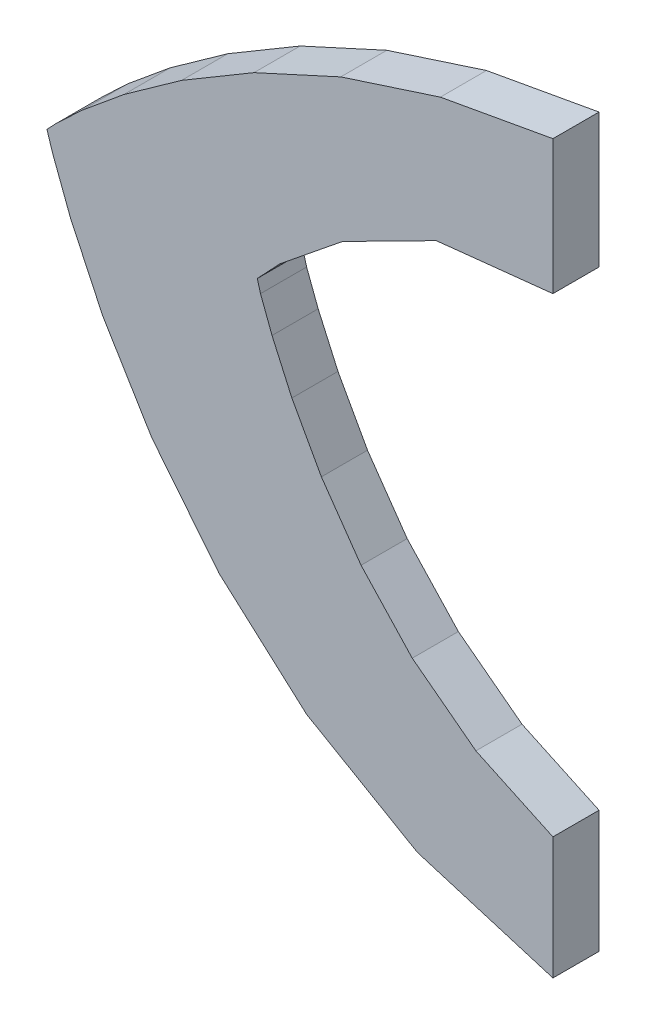
ISO-10303-21;
HEADER;
FILE_DESCRIPTION(('STEP AP214'),'2;1');
FILE_NAME('part.step','',(''),(''),'','','');
FILE_SCHEMA(('AUTOMOTIVE_DESIGN { 1 0 10303 214 1 1 1 1 }'));
ENDSEC;
DATA;
#1=APPLICATION_CONTEXT('core data for automotive mechanical design processes');
#2=APPLICATION_PROTOCOL_DEFINITION('international standard','automotive_design',2000,#1);
#3=PRODUCT_CONTEXT('',#1,'mechanical');
#4=PRODUCT('Part','Part','',(#3));
#5=PRODUCT_RELATED_PRODUCT_CATEGORY('part','',(#4));
#6=PRODUCT_DEFINITION_FORMATION('','',#4);
#7=PRODUCT_DEFINITION_CONTEXT('part definition',#1,'design');
#8=PRODUCT_DEFINITION('design','',#6,#7);
#9=PRODUCT_DEFINITION_SHAPE('','',#8);
#10=(LENGTH_UNIT() NAMED_UNIT(*) SI_UNIT(.MILLI.,.METRE.));
#11=(NAMED_UNIT(*) PLANE_ANGLE_UNIT() SI_UNIT($,.RADIAN.));
#12=(NAMED_UNIT(*) SI_UNIT($,.STERADIAN.) SOLID_ANGLE_UNIT());
#13=UNCERTAINTY_MEASURE_WITH_UNIT(LENGTH_MEASURE(1.E-05),#10,'distance_accuracy_value','');
#14=(GEOMETRIC_REPRESENTATION_CONTEXT(3) GLOBAL_UNCERTAINTY_ASSIGNED_CONTEXT((#13)) GLOBAL_UNIT_ASSIGNED_CONTEXT((#10,
#11,#12)) REPRESENTATION_CONTEXT('',''));
#15=CARTESIAN_POINT('',(0.,0.,0.));
#16=DIRECTION('',(0.,0.,1.));
#17=DIRECTION('',(1.,0.,0.));
#18=AXIS2_PLACEMENT_3D('',#15,#16,#17);
#19=CARTESIAN_POINT('',(0.,0.,0.1));
#20=DIRECTION('',(0.,0.,1.));
#21=DIRECTION('',(1.,0.,0.));
#22=AXIS2_PLACEMENT_3D('',#19,#20,#21);
#23=PLANE('',#22);
#24=DIRECTION('',(0.994353672393509,0.106116795077601,0.));
#25=VECTOR('',#24,1.);
#26=CARTESIAN_POINT('',(-1.526,1.481,0.1));
#27=LINE('',#26,#25);
#28=CARTESIAN_POINT('',(-1.273,1.508,0.1));
#29=VERTEX_POINT('',#28);
#30=CARTESIAN_POINT('',(-1.526,1.481,0.1));
#31=VERTEX_POINT('',#30);
#32=EDGE_CURVE('E226',#29,#31,#27,.F.);
#33=ORIENTED_EDGE('',*,*,#32,.F.);
#34=DIRECTION('',(0.,1.,0.));
#35=VECTOR('',#34,1.);
#36=CARTESIAN_POINT('',(-1.273,1.508,0.1));
#37=LINE('',#36,#35);
#38=CARTESIAN_POINT('',(-1.273,1.799,0.1));
#39=VERTEX_POINT('',#38);
#40=EDGE_CURVE('E20',#39,#29,#37,.F.);
#41=ORIENTED_EDGE('',*,*,#40,.F.);
#42=DIRECTION('',(-0.984127017445098,-0.177465527736,0.));
#43=VECTOR('',#42,1.);
#44=CARTESIAN_POINT('',(-1.273,1.799,0.1));
#45=LINE('',#44,#43);
#46=CARTESIAN_POINT('',(-1.517,1.755,0.1));
#47=VERTEX_POINT('',#46);
#48=EDGE_CURVE('E215',#47,#39,#45,.F.);
#49=ORIENTED_EDGE('',*,*,#48,.F.);
#50=DIRECTION('',(-0.951292655223298,-0.308289286414899,0.));
#51=VECTOR('',#50,1.);
#52=CARTESIAN_POINT('',(-1.517,1.755,0.1));
#53=LINE('',#52,#51);
#54=CARTESIAN_POINT('',(-1.733,1.685,0.1));
#55=VERTEX_POINT('',#54);
#56=EDGE_CURVE('E210',#55,#47,#53,.F.);
#57=ORIENTED_EDGE('',*,*,#56,.F.);
#58=DIRECTION('',(-0.909369932081494,-0.415988373186197,0.));
#59=VECTOR('',#58,1.);
#60=CARTESIAN_POINT('',(-1.733,1.685,0.1));
#61=LINE('',#60,#59);
#62=CARTESIAN_POINT('',(-1.921,1.599,0.1));
#63=VERTEX_POINT('',#62);
#64=EDGE_CURVE('E237',#63,#55,#61,.F.);
#65=ORIENTED_EDGE('',*,*,#64,.F.);
#66=DIRECTION('',(-0.860380537872695,-0.509652165746297,0.));
#67=VECTOR('',#66,1.);
#68=CARTESIAN_POINT('',(-1.921,1.599,0.1));
#69=LINE('',#68,#67);
#70=CARTESIAN_POINT('',(-2.078,1.506,0.1));
#71=VERTEX_POINT('',#70);
#72=EDGE_CURVE('E241',#71,#63,#69,.F.);
#73=ORIENTED_EDGE('',*,*,#72,.F.);
#74=DIRECTION('',(-0.814613200089862,-0.580004598463973,0.));
#75=VECTOR('',#74,1.);
#76=CARTESIAN_POINT('',(-2.078,1.506,0.1));
#77=LINE('',#76,#75);
#78=CARTESIAN_POINT('',(-2.203,1.417,0.1));
#79=VERTEX_POINT('',#78);
#80=EDGE_CURVE('E245',#79,#71,#77,.F.);
#81=ORIENTED_EDGE('',*,*,#80,.F.);
#82=DIRECTION('',(-0.77096175162709,-0.636881446996291,0.));
#83=VECTOR('',#82,1.);
#84=CARTESIAN_POINT('',(-2.203,1.417,0.1));
#85=LINE('',#84,#83);
#86=CARTESIAN_POINT('',(-2.295,1.341,0.1));
#87=VERTEX_POINT('',#86);
#88=EDGE_CURVE('E249',#87,#79,#85,.F.);
#89=ORIENTED_EDGE('',*,*,#88,.F.);
#90=DIRECTION('',(-0.726293399809764,-0.687384824819966,0.));
#91=VECTOR('',#90,1.);
#92=CARTESIAN_POINT('',(-2.295,1.341,0.1));
#93=LINE('',#92,#91);
#94=CARTESIAN_POINT('',(-2.351,1.288,0.1));
#95=VERTEX_POINT('',#94);
#96=EDGE_CURVE('E253',#95,#87,#93,.F.);
#97=ORIENTED_EDGE('',*,*,#96,.F.);
#98=DIRECTION('',(-0.688749461914704,-0.724999433594404,0.));
#99=VECTOR('',#98,1.);
#100=CARTESIAN_POINT('',(-2.351,1.288,0.1));
#101=LINE('',#100,#99);
#102=CARTESIAN_POINT('',(-2.37,1.268,0.1));
#103=VERTEX_POINT('',#102);
#104=EDGE_CURVE('E257',#103,#95,#101,.F.);
#105=ORIENTED_EDGE('',*,*,#104,.F.);
#106=DIRECTION('',(0.301131367937112,-0.953582665134137,0.));
#107=VECTOR('',#106,1.);
#108=CARTESIAN_POINT('',(-2.37,1.268,0.1));
#109=LINE('',#108,#107);
#110=CARTESIAN_POINT('',(-2.358,1.23,0.1));
#111=VERTEX_POINT('',#110);
#112=EDGE_CURVE('E261',#111,#103,#109,.F.);
#113=ORIENTED_EDGE('',*,*,#112,.F.);
#114=DIRECTION('',(0.354106750989689,-0.935205009023971,0.));
#115=VECTOR('',#114,1.);
#116=CARTESIAN_POINT('',(-2.358,1.23,0.1));
#117=LINE('',#116,#115);
#118=CARTESIAN_POINT('',(-2.319,1.127,0.1));
#119=VERTEX_POINT('',#118);
#120=EDGE_CURVE('E265',#119,#111,#117,.F.);
#121=ORIENTED_EDGE('',*,*,#120,.F.);
#122=DIRECTION('',(0.425211872296419,-0.90509384245954,0.));
#123=VECTOR('',#122,1.);
#124=CARTESIAN_POINT('',(-2.319,1.127,0.1));
#125=LINE('',#124,#123);
#126=CARTESIAN_POINT('',(-2.249,0.978,0.1));
#127=VERTEX_POINT('',#126);
#128=EDGE_CURVE('E269',#127,#119,#125,.F.);
#129=ORIENTED_EDGE('',*,*,#128,.F.);
#130=DIRECTION('',(0.518085056573783,-0.855329102834073,0.));
#131=VECTOR('',#130,1.);
#132=CARTESIAN_POINT('',(-2.249,0.978,0.1));
#133=LINE('',#132,#131);
#134=CARTESIAN_POINT('',(-2.143,0.803,0.1));
#135=VERTEX_POINT('',#134);
#136=EDGE_CURVE('E273',#135,#127,#133,.F.);
#137=ORIENTED_EDGE('',*,*,#136,.F.);
#138=DIRECTION('',(0.625739826636618,-0.780031838684022,0.));
#139=VECTOR('',#138,1.);
#140=CARTESIAN_POINT('',(-2.143,0.803,0.1));
#141=LINE('',#140,#139);
#142=CARTESIAN_POINT('',(-1.997,0.621,0.1));
#143=VERTEX_POINT('',#142);
#144=EDGE_CURVE('E277',#143,#135,#141,.F.);
#145=ORIENTED_EDGE('',*,*,#144,.F.);
#146=DIRECTION('',(0.745241313525112,-0.666794859469811,0.));
#147=VECTOR('',#146,1.);
#148=CARTESIAN_POINT('',(-1.997,0.621,0.1));
#149=LINE('',#148,#147);
#150=CARTESIAN_POINT('',(-1.807,0.451000000000001,0.1));
#151=VERTEX_POINT('',#150);
#152=EDGE_CURVE('E281',#151,#143,#149,.F.);
#153=ORIENTED_EDGE('',*,*,#152,.F.);
#154=DIRECTION('',(0.865343988334055,-0.501178393243474,0.));
#155=VECTOR('',#154,1.);
#156=CARTESIAN_POINT('',(-1.807,0.451,0.1));
#157=LINE('',#156,#155);
#158=CARTESIAN_POINT('',(-1.567,0.312,0.1));
#159=VERTEX_POINT('',#158);
#160=EDGE_CURVE('E285',#159,#151,#157,.F.);
#161=ORIENTED_EDGE('',*,*,#160,.F.);
#162=DIRECTION('',(0.957106505600417,-0.289736323123905,0.));
#163=VECTOR('',#162,1.);
#164=CARTESIAN_POINT('',(-1.567,0.312,0.1));
#165=LINE('',#164,#163);
#166=CARTESIAN_POINT('',(-1.273,0.223000000000002,0.1));
#167=VERTEX_POINT('',#166);
#168=EDGE_CURVE('E289',#167,#159,#165,.F.);
#169=ORIENTED_EDGE('',*,*,#168,.F.);
#170=DIRECTION('',(0.,1.,0.));
#171=VECTOR('',#170,1.);
#172=CARTESIAN_POINT('',(-1.273,0.223,0.1));
#173=LINE('',#172,#171);
#174=CARTESIAN_POINT('',(-1.273,0.488,0.1));
#175=VERTEX_POINT('',#174);
#176=EDGE_CURVE('E293',#175,#167,#173,.F.);
#177=ORIENTED_EDGE('',*,*,#176,.F.);
#178=DIRECTION('',(-0.906044485800401,0.4231824544457,0.));
#179=VECTOR('',#178,1.);
#180=CARTESIAN_POINT('',(-1.273,0.488,0.1));
#181=LINE('',#180,#179);
#182=CARTESIAN_POINT('',(-1.44,0.566000000000001,0.1));
#183=VERTEX_POINT('',#182);
#184=EDGE_CURVE('E297',#183,#175,#181,.F.);
#185=ORIENTED_EDGE('',*,*,#184,.F.);
#186=DIRECTION('',(-0.795828694120856,0.605521832483267,0.));
#187=VECTOR('',#186,1.);
#188=CARTESIAN_POINT('',(-1.44,0.566,0.1));
#189=LINE('',#188,#187);
#190=CARTESIAN_POINT('',(-1.578,0.671000000000001,0.1));
#191=VERTEX_POINT('',#190);
#192=EDGE_CURVE('E301',#191,#183,#189,.F.);
#193=ORIENTED_EDGE('',*,*,#192,.F.);
#194=DIRECTION('',(-0.682099275394579,0.731259583531177,0.));
#195=VECTOR('',#194,1.);
#196=CARTESIAN_POINT('',(-1.578,0.671,0.1));
#197=LINE('',#196,#195);
#198=CARTESIAN_POINT('',(-1.689,0.790000000000001,0.1));
#199=VERTEX_POINT('',#198);
#200=EDGE_CURVE('E305',#199,#191,#197,.F.);
#201=ORIENTED_EDGE('',*,*,#200,.F.);
#202=DIRECTION('',(-0.573015080001397,0.819544823722896,0.));
#203=VECTOR('',#202,1.);
#204=CARTESIAN_POINT('',(-1.689,0.79,0.1));
#205=LINE('',#204,#203);
#206=CARTESIAN_POINT('',(-1.775,0.912999999999999,0.1));
#207=VERTEX_POINT('',#206);
#208=EDGE_CURVE('E309',#207,#199,#205,.F.);
#209=ORIENTED_EDGE('',*,*,#208,.F.);
#210=DIRECTION('',(-0.483077342911306,0.87557768402681,0.));
#211=VECTOR('',#210,1.);
#212=CARTESIAN_POINT('',(-1.775,0.913,0.1));
#213=LINE('',#212,#211);
#214=CARTESIAN_POINT('',(-1.839,1.029,0.1));
#215=VERTEX_POINT('',#214);
#216=EDGE_CURVE('E313',#215,#207,#213,.F.);
#217=ORIENTED_EDGE('',*,*,#216,.F.);
#218=DIRECTION('',(-0.408782924594074,0.912631645605342,0.));
#219=VECTOR('',#218,1.);
#220=CARTESIAN_POINT('',(-1.839,1.029,0.1));
#221=LINE('',#220,#219);
#222=CARTESIAN_POINT('',(-1.882,1.125,0.1));
#223=VERTEX_POINT('',#222);
#224=EDGE_CURVE('E317',#223,#215,#221,.F.);
#225=ORIENTED_EDGE('',*,*,#224,.F.);
#226=DIRECTION('',(-0.354227062609786,0.935159445289862,0.));
#227=VECTOR('',#226,1.);
#228=CARTESIAN_POINT('',(-1.882,1.125,0.1));
#229=LINE('',#228,#227);
#230=CARTESIAN_POINT('',(-1.907,1.191,0.1));
#231=VERTEX_POINT('',#230);
#232=EDGE_CURVE('E321',#231,#223,#229,.F.);
#233=ORIENTED_EDGE('',*,*,#232,.F.);
#234=DIRECTION('',(-0.2696299255199,0.962964019714201,0.));
#235=VECTOR('',#234,1.);
#236=CARTESIAN_POINT('',(-1.907,1.191,0.1));
#237=LINE('',#236,#235);
#238=CARTESIAN_POINT('',(-1.914,1.216,0.1));
#239=VERTEX_POINT('',#238);
#240=EDGE_CURVE('E325',#239,#231,#237,.F.);
#241=ORIENTED_EDGE('',*,*,#240,.F.);
#242=DIRECTION('',(0.685801146497114,0.727788971792815,0.));
#243=VECTOR('',#242,1.);
#244=CARTESIAN_POINT('',(-1.914,1.216,0.1));
#245=LINE('',#244,#243);
#246=CARTESIAN_POINT('',(-1.865,1.268,0.1));
#247=VERTEX_POINT('',#246);
#248=EDGE_CURVE('E329',#247,#239,#245,.F.);
#249=ORIENTED_EDGE('',*,*,#248,.F.);
#250=DIRECTION('',(0.777511072023973,0.628869249431178,0.));
#251=VECTOR('',#250,1.);
#252=CARTESIAN_POINT('',(-1.865,1.268,0.1));
#253=LINE('',#252,#251);
#254=CARTESIAN_POINT('',(-1.729,1.378,0.1));
#255=VERTEX_POINT('',#254);
#256=EDGE_CURVE('E333',#255,#247,#253,.F.);
#257=ORIENTED_EDGE('',*,*,#256,.F.);
#258=DIRECTION('',(0.891775865287603,0.452477409480901,0.));
#259=VECTOR('',#258,1.);
#260=CARTESIAN_POINT('',(-1.729,1.378,0.1));
#261=LINE('',#260,#259);
#262=EDGE_CURVE('E337',#31,#255,#261,.F.);
#263=ORIENTED_EDGE('',*,*,#262,.F.);
#264=EDGE_LOOP('',(#33,#41,#49,#57,#65,#73,#81,#89,#97,#105,#113,#121,#129,#137,#145,#153,#161,
#169,#177,#185,#193,#201,#209,#217,#225,#233,#241,#249,#257,#263));
#265=FACE_BOUND('',#264,.T.);
#266=ADVANCED_FACE('F17',(#265),#23,.T.);
#267=CARTESIAN_POINT('',(-1.273,1.508,0.));
#268=DIRECTION('',(1.,0.,0.));
#269=DIRECTION('',(0.,0.,-1.));
#270=AXIS2_PLACEMENT_3D('',#267,#268,#269);
#271=PLANE('',#270);
#272=DIRECTION('',(0.,0.,1.));
#273=VECTOR('',#272,1.);
#274=CARTESIAN_POINT('',(-1.273,1.50800000000001,0.));
#275=LINE('',#274,#273);
#276=CARTESIAN_POINT('',(-1.273,1.508,0.));
#277=VERTEX_POINT('',#276);
#278=EDGE_CURVE('E341',#277,#29,#275,.T.);
#279=ORIENTED_EDGE('',*,*,#278,.F.);
#280=DIRECTION('',(0.,1.,0.));
#281=VECTOR('',#280,1.);
#282=CARTESIAN_POINT('',(-1.273,0.,0.));
#283=LINE('',#282,#281);
#284=CARTESIAN_POINT('',(-1.273,1.799,0.));
#285=VERTEX_POINT('',#284);
#286=EDGE_CURVE('E232',#277,#285,#283,.T.);
#287=ORIENTED_EDGE('',*,*,#286,.T.);
#288=DIRECTION('',(0.,0.,1.));
#289=VECTOR('',#288,1.);
#290=CARTESIAN_POINT('',(-1.273,1.799,0.));
#291=LINE('',#290,#289);
#292=EDGE_CURVE('E220',#39,#285,#291,.F.);
#293=ORIENTED_EDGE('',*,*,#292,.F.);
#294=ORIENTED_EDGE('',*,*,#40,.T.);
#295=EDGE_LOOP('',(#279,#287,#293,#294));
#296=FACE_BOUND('',#295,.T.);
#297=ADVANCED_FACE('F231',(#296),#271,.T.);
#298=CARTESIAN_POINT('',(-1.273,1.799,0.));
#299=DIRECTION('',(-0.177465527736,0.984127017445098,0.));
#300=DIRECTION('',(-0.984127017445098,-0.177465527736,0.));
#301=AXIS2_PLACEMENT_3D('',#298,#299,#300);
#302=PLANE('',#301);
#303=ORIENTED_EDGE('',*,*,#292,.T.);
#304=DIRECTION('',(-0.984127017445097,-0.177465527736002,0.));
#305=VECTOR('',#304,1.);
#306=CARTESIAN_POINT('',(-1.273,1.799,0.));
#307=LINE('',#306,#305);
#308=CARTESIAN_POINT('',(-1.517,1.755,0.));
#309=VERTEX_POINT('',#308);
#310=EDGE_CURVE('E346',#285,#309,#307,.T.);
#311=ORIENTED_EDGE('',*,*,#310,.T.);
#312=DIRECTION('',(0.,0.,1.));
#313=VECTOR('',#312,1.);
#314=CARTESIAN_POINT('',(-1.517,1.755,0.));
#315=LINE('',#314,#313);
#316=EDGE_CURVE('E222',#47,#309,#315,.F.);
#317=ORIENTED_EDGE('',*,*,#316,.F.);
#318=ORIENTED_EDGE('',*,*,#48,.T.);
#319=EDGE_LOOP('',(#303,#311,#317,#318));
#320=FACE_BOUND('',#319,.T.);
#321=ADVANCED_FACE('F217',(#320),#302,.T.);
#322=CARTESIAN_POINT('',(-1.517,1.755,0.));
#323=DIRECTION('',(-0.308289286414899,0.951292655223298,0.));
#324=DIRECTION('',(-0.951292655223298,-0.308289286414899,0.));
#325=AXIS2_PLACEMENT_3D('',#322,#323,#324);
#326=PLANE('',#325);
#327=ORIENTED_EDGE('',*,*,#316,.T.);
#328=DIRECTION('',(-0.951292655223281,-0.308289286414951,0.));
#329=VECTOR('',#328,1.);
#330=CARTESIAN_POINT('',(-1.517,1.755,0.));
#331=LINE('',#330,#329);
#332=CARTESIAN_POINT('',(-1.733,1.68500000000001,0.));
#333=VERTEX_POINT('',#332);
#334=EDGE_CURVE('E348',#309,#333,#331,.T.);
#335=ORIENTED_EDGE('',*,*,#334,.T.);
#336=DIRECTION('',(0.,0.,1.));
#337=VECTOR('',#336,1.);
#338=CARTESIAN_POINT('',(-1.733,1.685,0.));
#339=LINE('',#338,#337);
#340=EDGE_CURVE('E239',#55,#333,#339,.F.);
#341=ORIENTED_EDGE('',*,*,#340,.F.);
#342=ORIENTED_EDGE('',*,*,#56,.T.);
#343=EDGE_LOOP('',(#327,#335,#341,#342));
#344=FACE_BOUND('',#343,.T.);
#345=ADVANCED_FACE('F558',(#344),#326,.T.);
#346=CARTESIAN_POINT('',(-1.733,1.685,0.));
#347=DIRECTION('',(-0.415988373186197,0.909369932081494,0.));
#348=DIRECTION('',(-0.909369932081494,-0.415988373186197,0.));
#349=AXIS2_PLACEMENT_3D('',#346,#347,#348);
#350=PLANE('',#349);
#351=ORIENTED_EDGE('',*,*,#340,.T.);
#352=DIRECTION('',(-0.909369932081487,-0.415988373186213,0.));
#353=VECTOR('',#352,1.);
#354=CARTESIAN_POINT('',(-1.733,1.685,0.));
#355=LINE('',#354,#353);
#356=CARTESIAN_POINT('',(-1.921,1.599,0.));
#357=VERTEX_POINT('',#356);
#358=EDGE_CURVE('E351',#333,#357,#355,.T.);
#359=ORIENTED_EDGE('',*,*,#358,.T.);
#360=DIRECTION('',(0.,0.,1.));
#361=VECTOR('',#360,1.);
#362=CARTESIAN_POINT('',(-1.921,1.599,0.));
#363=LINE('',#362,#361);
#364=EDGE_CURVE('E243',#63,#357,#363,.F.);
#365=ORIENTED_EDGE('',*,*,#364,.F.);
#366=ORIENTED_EDGE('',*,*,#64,.T.);
#367=EDGE_LOOP('',(#351,#359,#365,#366));
#368=FACE_BOUND('',#367,.T.);
#369=ADVANCED_FACE('F557',(#368),#350,.T.);
#370=CARTESIAN_POINT('',(-1.921,1.599,0.));
#371=DIRECTION('',(-0.509652165746297,0.860380537872695,0.));
#372=DIRECTION('',(-0.860380537872695,-0.509652165746297,0.));
#373=AXIS2_PLACEMENT_3D('',#370,#371,#372);
#374=PLANE('',#373);
#375=ORIENTED_EDGE('',*,*,#364,.T.);
#376=DIRECTION('',(-0.860380537872718,-0.50965216574626,0.));
#377=VECTOR('',#376,1.);
#378=CARTESIAN_POINT('',(-1.921,1.599,0.));
#379=LINE('',#378,#377);
#380=CARTESIAN_POINT('',(-2.078,1.506,0.));
#381=VERTEX_POINT('',#380);
#382=EDGE_CURVE('E354',#357,#381,#379,.T.);
#383=ORIENTED_EDGE('',*,*,#382,.T.);
#384=DIRECTION('',(0.,0.,1.));
#385=VECTOR('',#384,1.);
#386=CARTESIAN_POINT('',(-2.078,1.506,0.));
#387=LINE('',#386,#385);
#388=EDGE_CURVE('E247',#71,#381,#387,.F.);
#389=ORIENTED_EDGE('',*,*,#388,.F.);
#390=ORIENTED_EDGE('',*,*,#72,.T.);
#391=EDGE_LOOP('',(#375,#383,#389,#390));
#392=FACE_BOUND('',#391,.T.);
#393=ADVANCED_FACE('F551',(#392),#374,.T.);
#394=CARTESIAN_POINT('',(-2.078,1.506,0.));
#395=DIRECTION('',(-0.580004598463973,0.814613200089862,0.));
#396=DIRECTION('',(-0.814613200089862,-0.580004598463973,0.));
#397=AXIS2_PLACEMENT_3D('',#394,#395,#396);
#398=PLANE('',#397);
#399=ORIENTED_EDGE('',*,*,#388,.T.);
#400=DIRECTION('',(-0.814613200089858,-0.580004598463978,0.));
#401=VECTOR('',#400,1.);
#402=CARTESIAN_POINT('',(-2.078,1.506,0.));
#403=LINE('',#402,#401);
#404=CARTESIAN_POINT('',(-2.203,1.417,0.));
#405=VERTEX_POINT('',#404);
#406=EDGE_CURVE('E357',#381,#405,#403,.T.);
#407=ORIENTED_EDGE('',*,*,#406,.T.);
#408=DIRECTION('',(0.,0.,1.));
#409=VECTOR('',#408,1.);
#410=CARTESIAN_POINT('',(-2.203,1.417,0.));
#411=LINE('',#410,#409);
#412=EDGE_CURVE('E251',#79,#405,#411,.F.);
#413=ORIENTED_EDGE('',*,*,#412,.F.);
#414=ORIENTED_EDGE('',*,*,#80,.T.);
#415=EDGE_LOOP('',(#399,#407,#413,#414));
#416=FACE_BOUND('',#415,.T.);
#417=ADVANCED_FACE('F547',(#416),#398,.T.);
#418=CARTESIAN_POINT('',(-2.203,1.417,0.));
#419=DIRECTION('',(-0.636881446996291,0.77096175162709,0.));
#420=DIRECTION('',(-0.77096175162709,-0.636881446996291,0.));
#421=AXIS2_PLACEMENT_3D('',#418,#419,#420);
#422=PLANE('',#421);
#423=ORIENTED_EDGE('',*,*,#412,.T.);
#424=DIRECTION('',(-0.770961751627089,-0.636881446996292,0.));
#425=VECTOR('',#424,1.);
#426=CARTESIAN_POINT('',(-2.203,1.417,0.));
#427=LINE('',#426,#425);
#428=CARTESIAN_POINT('',(-2.295,1.341,0.));
#429=VERTEX_POINT('',#428);
#430=EDGE_CURVE('E360',#405,#429,#427,.T.);
#431=ORIENTED_EDGE('',*,*,#430,.T.);
#432=DIRECTION('',(0.,0.,1.));
#433=VECTOR('',#432,1.);
#434=CARTESIAN_POINT('',(-2.295,1.341,0.));
#435=LINE('',#434,#433);
#436=EDGE_CURVE('E255',#87,#429,#435,.F.);
#437=ORIENTED_EDGE('',*,*,#436,.F.);
#438=ORIENTED_EDGE('',*,*,#88,.T.);
#439=EDGE_LOOP('',(#423,#431,#437,#438));
#440=FACE_BOUND('',#439,.T.);
#441=ADVANCED_FACE('F541',(#440),#422,.T.);
#442=CARTESIAN_POINT('',(-2.295,1.341,0.));
#443=DIRECTION('',(-0.687384824819966,0.726293399809764,0.));
#444=DIRECTION('',(-0.726293399809764,-0.687384824819966,0.));
#445=AXIS2_PLACEMENT_3D('',#442,#443,#444);
#446=PLANE('',#445);
#447=ORIENTED_EDGE('',*,*,#436,.T.);
#448=DIRECTION('',(-0.72629339980977,-0.687384824819959,0.));
#449=VECTOR('',#448,1.);
#450=CARTESIAN_POINT('',(-2.295,1.341,0.));
#451=LINE('',#450,#449);
#452=CARTESIAN_POINT('',(-2.351,1.288,0.));
#453=VERTEX_POINT('',#452);
#454=EDGE_CURVE('E363',#429,#453,#451,.T.);
#455=ORIENTED_EDGE('',*,*,#454,.T.);
#456=DIRECTION('',(0.,0.,1.));
#457=VECTOR('',#456,1.);
#458=CARTESIAN_POINT('',(-2.351,1.288,0.));
#459=LINE('',#458,#457);
#460=EDGE_CURVE('E259',#95,#453,#459,.F.);
#461=ORIENTED_EDGE('',*,*,#460,.F.);
#462=ORIENTED_EDGE('',*,*,#96,.T.);
#463=EDGE_LOOP('',(#447,#455,#461,#462));
#464=FACE_BOUND('',#463,.T.);
#465=ADVANCED_FACE('F537',(#464),#446,.T.);
#466=CARTESIAN_POINT('',(-2.351,1.288,0.));
#467=DIRECTION('',(-0.724999433594404,0.688749461914704,0.));
#468=DIRECTION('',(-0.688749461914704,-0.724999433594404,0.));
#469=AXIS2_PLACEMENT_3D('',#466,#467,#468);
#470=PLANE('',#469);
#471=ORIENTED_EDGE('',*,*,#460,.T.);
#472=DIRECTION('',(-0.688749461914691,-0.724999433594416,0.));
#473=VECTOR('',#472,1.);
#474=CARTESIAN_POINT('',(-2.351,1.288,0.));
#475=LINE('',#474,#473);
#476=CARTESIAN_POINT('',(-2.37,1.268,0.));
#477=VERTEX_POINT('',#476);
#478=EDGE_CURVE('E366',#453,#477,#475,.T.);
#479=ORIENTED_EDGE('',*,*,#478,.T.);
#480=DIRECTION('',(0.,0.,1.));
#481=VECTOR('',#480,1.);
#482=CARTESIAN_POINT('',(-2.37,1.268,0.));
#483=LINE('',#482,#481);
#484=EDGE_CURVE('E263',#103,#477,#483,.F.);
#485=ORIENTED_EDGE('',*,*,#484,.F.);
#486=ORIENTED_EDGE('',*,*,#104,.T.);
#487=EDGE_LOOP('',(#471,#479,#485,#486));
#488=FACE_BOUND('',#487,.T.);
#489=ADVANCED_FACE('F531',(#488),#470,.T.);
#490=CARTESIAN_POINT('',(-2.37,1.268,0.));
#491=DIRECTION('',(-0.953582665134137,-0.301131367937112,0.));
#492=DIRECTION('',(0.301131367937112,-0.953582665134137,0.));
#493=AXIS2_PLACEMENT_3D('',#490,#491,#492);
#494=PLANE('',#493);
#495=ORIENTED_EDGE('',*,*,#484,.T.);
#496=DIRECTION('',(0.301131367937094,-0.953582665134143,0.));
#497=VECTOR('',#496,1.);
#498=CARTESIAN_POINT('',(-2.37,1.268,0.));
#499=LINE('',#498,#497);
#500=CARTESIAN_POINT('',(-2.358,1.23,0.));
#501=VERTEX_POINT('',#500);
#502=EDGE_CURVE('E369',#477,#501,#499,.T.);
#503=ORIENTED_EDGE('',*,*,#502,.T.);
#504=DIRECTION('',(0.,0.,1.));
#505=VECTOR('',#504,1.);
#506=CARTESIAN_POINT('',(-2.358,1.23,0.));
#507=LINE('',#506,#505);
#508=EDGE_CURVE('E267',#111,#501,#507,.F.);
#509=ORIENTED_EDGE('',*,*,#508,.F.);
#510=ORIENTED_EDGE('',*,*,#112,.T.);
#511=EDGE_LOOP('',(#495,#503,#509,#510));
#512=FACE_BOUND('',#511,.T.);
#513=ADVANCED_FACE('F527',(#512),#494,.T.);
#514=CARTESIAN_POINT('',(-2.358,1.23,0.));
#515=DIRECTION('',(-0.935205009023971,-0.354106750989689,0.));
#516=DIRECTION('',(0.354106750989689,-0.935205009023971,0.));
#517=AXIS2_PLACEMENT_3D('',#514,#515,#516);
#518=PLANE('',#517);
#519=ORIENTED_EDGE('',*,*,#508,.T.);
#520=DIRECTION('',(0.354106750989666,-0.93520500902398,0.));
#521=VECTOR('',#520,1.);
#522=CARTESIAN_POINT('',(-2.358,1.23,0.));
#523=LINE('',#522,#521);
#524=CARTESIAN_POINT('',(-2.319,1.127,0.));
#525=VERTEX_POINT('',#524);
#526=EDGE_CURVE('E372',#501,#525,#523,.T.);
#527=ORIENTED_EDGE('',*,*,#526,.T.);
#528=DIRECTION('',(0.,0.,1.));
#529=VECTOR('',#528,1.);
#530=CARTESIAN_POINT('',(-2.319,1.127,0.));
#531=LINE('',#530,#529);
#532=EDGE_CURVE('E271',#119,#525,#531,.F.);
#533=ORIENTED_EDGE('',*,*,#532,.F.);
#534=ORIENTED_EDGE('',*,*,#120,.T.);
#535=EDGE_LOOP('',(#519,#527,#533,#534));
#536=FACE_BOUND('',#535,.T.);
#537=ADVANCED_FACE('F521',(#536),#518,.T.);
#538=CARTESIAN_POINT('',(-2.319,1.127,0.));
#539=DIRECTION('',(-0.90509384245954,-0.425211872296419,0.));
#540=DIRECTION('',(0.425211872296419,-0.90509384245954,0.));
#541=AXIS2_PLACEMENT_3D('',#538,#539,#540);
#542=PLANE('',#541);
#543=ORIENTED_EDGE('',*,*,#532,.T.);
#544=DIRECTION('',(0.425211872296425,-0.905093842459537,0.));
#545=VECTOR('',#544,1.);
#546=CARTESIAN_POINT('',(-2.319,1.127,0.));
#547=LINE('',#546,#545);
#548=CARTESIAN_POINT('',(-2.249,0.978,0.));
#549=VERTEX_POINT('',#548);
#550=EDGE_CURVE('E375',#525,#549,#547,.T.);
#551=ORIENTED_EDGE('',*,*,#550,.T.);
#552=DIRECTION('',(0.,0.,1.));
#553=VECTOR('',#552,1.);
#554=CARTESIAN_POINT('',(-2.249,0.978,0.));
#555=LINE('',#554,#553);
#556=EDGE_CURVE('E275',#127,#549,#555,.F.);
#557=ORIENTED_EDGE('',*,*,#556,.F.);
#558=ORIENTED_EDGE('',*,*,#128,.T.);
#559=EDGE_LOOP('',(#543,#551,#557,#558));
#560=FACE_BOUND('',#559,.T.);
#561=ADVANCED_FACE('F517',(#560),#542,.T.);
#562=CARTESIAN_POINT('',(-2.249,0.978,0.));
#563=DIRECTION('',(-0.855329102834073,-0.518085056573783,0.));
#564=DIRECTION('',(0.518085056573783,-0.855329102834073,0.));
#565=AXIS2_PLACEMENT_3D('',#562,#563,#564);
#566=PLANE('',#565);
#567=ORIENTED_EDGE('',*,*,#556,.T.);
#568=DIRECTION('',(0.518085056573783,-0.855329102834073,0.));
#569=VECTOR('',#568,1.);
#570=CARTESIAN_POINT('',(-2.249,0.978,0.));
#571=LINE('',#570,#569);
#572=CARTESIAN_POINT('',(-2.143,0.803,0.));
#573=VERTEX_POINT('',#572);
#574=EDGE_CURVE('E378',#549,#573,#571,.T.);
#575=ORIENTED_EDGE('',*,*,#574,.T.);
#576=DIRECTION('',(0.,0.,1.));
#577=VECTOR('',#576,1.);
#578=CARTESIAN_POINT('',(-2.143,0.803,0.));
#579=LINE('',#578,#577);
#580=EDGE_CURVE('E279',#135,#573,#579,.F.);
#581=ORIENTED_EDGE('',*,*,#580,.F.);
#582=ORIENTED_EDGE('',*,*,#136,.T.);
#583=EDGE_LOOP('',(#567,#575,#581,#582));
#584=FACE_BOUND('',#583,.T.);
#585=ADVANCED_FACE('F511',(#584),#566,.T.);
#586=CARTESIAN_POINT('',(-2.143,0.803,0.));
#587=DIRECTION('',(-0.780031838684022,-0.625739826636618,0.));
#588=DIRECTION('',(0.625739826636618,-0.780031838684022,0.));
#589=AXIS2_PLACEMENT_3D('',#586,#587,#588);
#590=PLANE('',#589);
#591=ORIENTED_EDGE('',*,*,#580,.T.);
#592=DIRECTION('',(0.625739826636626,-0.780031838684015,0.));
#593=VECTOR('',#592,1.);
#594=CARTESIAN_POINT('',(-2.143,0.803,0.));
#595=LINE('',#594,#593);
#596=CARTESIAN_POINT('',(-1.997,0.620999999999999,0.));
#597=VERTEX_POINT('',#596);
#598=EDGE_CURVE('E381',#573,#597,#595,.T.);
#599=ORIENTED_EDGE('',*,*,#598,.T.);
#600=DIRECTION('',(0.,0.,1.));
#601=VECTOR('',#600,1.);
#602=CARTESIAN_POINT('',(-1.997,0.621,0.));
#603=LINE('',#602,#601);
#604=EDGE_CURVE('E283',#143,#597,#603,.F.);
#605=ORIENTED_EDGE('',*,*,#604,.F.);
#606=ORIENTED_EDGE('',*,*,#144,.T.);
#607=EDGE_LOOP('',(#591,#599,#605,#606));
#608=FACE_BOUND('',#607,.T.);
#609=ADVANCED_FACE('F507',(#608),#590,.T.);
#610=CARTESIAN_POINT('',(-1.997,0.621,0.));
#611=DIRECTION('',(-0.666794859469811,-0.745241313525112,0.));
#612=DIRECTION('',(0.745241313525112,-0.666794859469811,0.));
#613=AXIS2_PLACEMENT_3D('',#610,#611,#612);
#614=PLANE('',#613);
#615=ORIENTED_EDGE('',*,*,#604,.T.);
#616=DIRECTION('',(0.745241313525099,-0.666794859469826,0.));
#617=VECTOR('',#616,1.);
#618=CARTESIAN_POINT('',(-1.997,0.621,0.));
#619=LINE('',#618,#617);
#620=CARTESIAN_POINT('',(-1.807,0.451000000000002,0.));
#621=VERTEX_POINT('',#620);
#622=EDGE_CURVE('E384',#597,#621,#619,.T.);
#623=ORIENTED_EDGE('',*,*,#622,.T.);
#624=DIRECTION('',(0.,0.,1.));
#625=VECTOR('',#624,1.);
#626=CARTESIAN_POINT('',(-1.807,0.451,0.));
#627=LINE('',#626,#625);
#628=EDGE_CURVE('E287',#151,#621,#627,.F.);
#629=ORIENTED_EDGE('',*,*,#628,.F.);
#630=ORIENTED_EDGE('',*,*,#152,.T.);
#631=EDGE_LOOP('',(#615,#623,#629,#630));
#632=FACE_BOUND('',#631,.T.);
#633=ADVANCED_FACE('F501',(#632),#614,.T.);
#634=CARTESIAN_POINT('',(-1.807,0.451,0.));
#635=DIRECTION('',(-0.501178393243474,-0.865343988334055,0.));
#636=DIRECTION('',(0.865343988334055,-0.501178393243474,0.));
#637=AXIS2_PLACEMENT_3D('',#634,#635,#636);
#638=PLANE('',#637);
#639=ORIENTED_EDGE('',*,*,#628,.T.);
#640=DIRECTION('',(0.865343988334055,-0.501178393243474,0.));
#641=VECTOR('',#640,1.);
#642=CARTESIAN_POINT('',(-1.807,0.451,0.));
#643=LINE('',#642,#641);
#644=CARTESIAN_POINT('',(-1.567,0.312,0.));
#645=VERTEX_POINT('',#644);
#646=EDGE_CURVE('E387',#621,#645,#643,.T.);
#647=ORIENTED_EDGE('',*,*,#646,.T.);
#648=DIRECTION('',(0.,0.,1.));
#649=VECTOR('',#648,1.);
#650=CARTESIAN_POINT('',(-1.567,0.312,0.));
#651=LINE('',#650,#649);
#652=EDGE_CURVE('E291',#159,#645,#651,.F.);
#653=ORIENTED_EDGE('',*,*,#652,.F.);
#654=ORIENTED_EDGE('',*,*,#160,.T.);
#655=EDGE_LOOP('',(#639,#647,#653,#654));
#656=FACE_BOUND('',#655,.T.);
#657=ADVANCED_FACE('F497',(#656),#638,.T.);
#658=CARTESIAN_POINT('',(-1.567,0.312,0.));
#659=DIRECTION('',(-0.289736323123905,-0.957106505600417,0.));
#660=DIRECTION('',(0.957106505600417,-0.289736323123905,0.));
#661=AXIS2_PLACEMENT_3D('',#658,#659,#660);
#662=PLANE('',#661);
#663=ORIENTED_EDGE('',*,*,#652,.T.);
#664=DIRECTION('',(0.957106505600408,-0.289736323123933,0.));
#665=VECTOR('',#664,1.);
#666=CARTESIAN_POINT('',(-1.567,0.312,0.));
#667=LINE('',#666,#665);
#668=CARTESIAN_POINT('',(-1.273,0.223000000000004,0.));
#669=VERTEX_POINT('',#668);
#670=EDGE_CURVE('E390',#645,#669,#667,.T.);
#671=ORIENTED_EDGE('',*,*,#670,.T.);
#672=DIRECTION('',(0.,0.,-1.));
#673=VECTOR('',#672,1.);
#674=CARTESIAN_POINT('',(-1.273,0.223,0.));
#675=LINE('',#674,#673);
#676=EDGE_CURVE('E295',#167,#669,#675,.T.);
#677=ORIENTED_EDGE('',*,*,#676,.F.);
#678=ORIENTED_EDGE('',*,*,#168,.T.);
#679=EDGE_LOOP('',(#663,#671,#677,#678));
#680=FACE_BOUND('',#679,.T.);
#681=ADVANCED_FACE('F491',(#680),#662,.T.);
#682=CARTESIAN_POINT('',(-1.273,0.223,0.));
#683=DIRECTION('',(1.,0.,0.));
#684=DIRECTION('',(0.,0.,-1.));
#685=AXIS2_PLACEMENT_3D('',#682,#683,#684);
#686=PLANE('',#685);
#687=ORIENTED_EDGE('',*,*,#676,.T.);
#688=DIRECTION('',(0.,1.,0.));
#689=VECTOR('',#688,1.);
#690=CARTESIAN_POINT('',(-1.273,0.,0.));
#691=LINE('',#690,#689);
#692=CARTESIAN_POINT('',(-1.273,0.488,0.));
#693=VERTEX_POINT('',#692);
#694=EDGE_CURVE('E393',#669,#693,#691,.T.);
#695=ORIENTED_EDGE('',*,*,#694,.T.);
#696=DIRECTION('',(0.,0.,1.));
#697=VECTOR('',#696,1.);
#698=CARTESIAN_POINT('',(-1.273,0.488,0.));
#699=LINE('',#698,#697);
#700=EDGE_CURVE('E299',#175,#693,#699,.F.);
#701=ORIENTED_EDGE('',*,*,#700,.F.);
#702=ORIENTED_EDGE('',*,*,#176,.T.);
#703=EDGE_LOOP('',(#687,#695,#701,#702));
#704=FACE_BOUND('',#703,.T.);
#705=ADVANCED_FACE('F487',(#704),#686,.T.);
#706=CARTESIAN_POINT('',(-1.273,0.488,0.));
#707=DIRECTION('',(0.4231824544457,0.906044485800401,0.));
#708=DIRECTION('',(-0.906044485800401,0.4231824544457,0.));
#709=AXIS2_PLACEMENT_3D('',#706,#707,#708);
#710=PLANE('',#709);
#711=ORIENTED_EDGE('',*,*,#700,.T.);
#712=DIRECTION('',(-0.906044485800402,0.423182454445697,0.));
#713=VECTOR('',#712,1.);
#714=CARTESIAN_POINT('',(-1.273,0.488,0.));
#715=LINE('',#714,#713);
#716=CARTESIAN_POINT('',(-1.44,0.566000000000001,0.));
#717=VERTEX_POINT('',#716);
#718=EDGE_CURVE('E396',#693,#717,#715,.T.);
#719=ORIENTED_EDGE('',*,*,#718,.T.);
#720=DIRECTION('',(0.,0.,1.));
#721=VECTOR('',#720,1.);
#722=CARTESIAN_POINT('',(-1.44,0.566,0.));
#723=LINE('',#722,#721);
#724=EDGE_CURVE('E303',#183,#717,#723,.F.);
#725=ORIENTED_EDGE('',*,*,#724,.F.);
#726=ORIENTED_EDGE('',*,*,#184,.T.);
#727=EDGE_LOOP('',(#711,#719,#725,#726));
#728=FACE_BOUND('',#727,.T.);
#729=ADVANCED_FACE('F481',(#728),#710,.T.);
#730=CARTESIAN_POINT('',(-1.44,0.566,0.));
#731=DIRECTION('',(0.605521832483267,0.795828694120856,0.));
#732=DIRECTION('',(-0.795828694120856,0.605521832483267,0.));
#733=AXIS2_PLACEMENT_3D('',#730,#731,#732);
#734=PLANE('',#733);
#735=ORIENTED_EDGE('',*,*,#724,.T.);
#736=DIRECTION('',(-0.79582869412086,0.605521832483262,0.));
#737=VECTOR('',#736,1.);
#738=CARTESIAN_POINT('',(-1.44,0.566,0.));
#739=LINE('',#738,#737);
#740=CARTESIAN_POINT('',(-1.578,0.671000000000001,0.));
#741=VERTEX_POINT('',#740);
#742=EDGE_CURVE('E399',#717,#741,#739,.T.);
#743=ORIENTED_EDGE('',*,*,#742,.T.);
#744=DIRECTION('',(0.,0.,1.));
#745=VECTOR('',#744,1.);
#746=CARTESIAN_POINT('',(-1.578,0.671,0.));
#747=LINE('',#746,#745);
#748=EDGE_CURVE('E307',#191,#741,#747,.F.);
#749=ORIENTED_EDGE('',*,*,#748,.F.);
#750=ORIENTED_EDGE('',*,*,#192,.T.);
#751=EDGE_LOOP('',(#735,#743,#749,#750));
#752=FACE_BOUND('',#751,.T.);
#753=ADVANCED_FACE('F477',(#752),#734,.T.);
#754=CARTESIAN_POINT('',(-1.578,0.671,0.));
#755=DIRECTION('',(0.731259583531177,0.682099275394579,0.));
#756=DIRECTION('',(-0.682099275394579,0.731259583531177,0.));
#757=AXIS2_PLACEMENT_3D('',#754,#755,#756);
#758=PLANE('',#757);
#759=ORIENTED_EDGE('',*,*,#748,.T.);
#760=DIRECTION('',(-0.682099275394605,0.731259583531153,0.));
#761=VECTOR('',#760,1.);
#762=CARTESIAN_POINT('',(-1.578,0.671,0.));
#763=LINE('',#762,#761);
#764=CARTESIAN_POINT('',(-1.689,0.790000000000002,0.));
#765=VERTEX_POINT('',#764);
#766=EDGE_CURVE('E402',#741,#765,#763,.T.);
#767=ORIENTED_EDGE('',*,*,#766,.T.);
#768=DIRECTION('',(0.,0.,1.));
#769=VECTOR('',#768,1.);
#770=CARTESIAN_POINT('',(-1.689,0.79,0.));
#771=LINE('',#770,#769);
#772=EDGE_CURVE('E311',#199,#765,#771,.F.);
#773=ORIENTED_EDGE('',*,*,#772,.F.);
#774=ORIENTED_EDGE('',*,*,#200,.T.);
#775=EDGE_LOOP('',(#759,#767,#773,#774));
#776=FACE_BOUND('',#775,.T.);
#777=ADVANCED_FACE('F471',(#776),#758,.T.);
#778=CARTESIAN_POINT('',(-1.689,0.79,0.));
#779=DIRECTION('',(0.819544823722896,0.573015080001397,0.));
#780=DIRECTION('',(-0.573015080001397,0.819544823722896,0.));
#781=AXIS2_PLACEMENT_3D('',#778,#779,#780);
#782=PLANE('',#781);
#783=ORIENTED_EDGE('',*,*,#772,.T.);
#784=DIRECTION('',(-0.57301508000138,0.819544823722908,0.));
#785=VECTOR('',#784,1.);
#786=CARTESIAN_POINT('',(-1.689,0.79,0.));
#787=LINE('',#786,#785);
#788=CARTESIAN_POINT('',(-1.775,0.912999999999999,0.));
#789=VERTEX_POINT('',#788);
#790=EDGE_CURVE('E405',#765,#789,#787,.T.);
#791=ORIENTED_EDGE('',*,*,#790,.T.);
#792=DIRECTION('',(0.,0.,1.));
#793=VECTOR('',#792,1.);
#794=CARTESIAN_POINT('',(-1.775,0.913,0.));
#795=LINE('',#794,#793);
#796=EDGE_CURVE('E315',#207,#789,#795,.F.);
#797=ORIENTED_EDGE('',*,*,#796,.F.);
#798=ORIENTED_EDGE('',*,*,#208,.T.);
#799=EDGE_LOOP('',(#783,#791,#797,#798));
#800=FACE_BOUND('',#799,.T.);
#801=ADVANCED_FACE('F467',(#800),#782,.T.);
#802=CARTESIAN_POINT('',(-1.775,0.913,0.));
#803=DIRECTION('',(0.87557768402681,0.483077342911306,0.));
#804=DIRECTION('',(-0.483077342911306,0.87557768402681,0.));
#805=AXIS2_PLACEMENT_3D('',#802,#803,#804);
#806=PLANE('',#805);
#807=ORIENTED_EDGE('',*,*,#796,.T.);
#808=DIRECTION('',(-0.483077342911335,0.875577684026794,0.));
#809=VECTOR('',#808,1.);
#810=CARTESIAN_POINT('',(-1.775,0.913,0.));
#811=LINE('',#810,#809);
#812=CARTESIAN_POINT('',(-1.839,1.029,0.));
#813=VERTEX_POINT('',#812);
#814=EDGE_CURVE('E408',#789,#813,#811,.T.);
#815=ORIENTED_EDGE('',*,*,#814,.T.);
#816=DIRECTION('',(0.,0.,1.));
#817=VECTOR('',#816,1.);
#818=CARTESIAN_POINT('',(-1.839,1.029,0.));
#819=LINE('',#818,#817);
#820=EDGE_CURVE('E319',#215,#813,#819,.F.);
#821=ORIENTED_EDGE('',*,*,#820,.F.);
#822=ORIENTED_EDGE('',*,*,#216,.T.);
#823=EDGE_LOOP('',(#807,#815,#821,#822));
#824=FACE_BOUND('',#823,.T.);
#825=ADVANCED_FACE('F461',(#824),#806,.T.);
#826=CARTESIAN_POINT('',(-1.839,1.029,0.));
#827=DIRECTION('',(0.912631645605342,0.408782924594074,0.));
#828=DIRECTION('',(-0.408782924594074,0.912631645605342,0.));
#829=AXIS2_PLACEMENT_3D('',#826,#827,#828);
#830=PLANE('',#829);
#831=ORIENTED_EDGE('',*,*,#820,.T.);
#832=DIRECTION('',(-0.408782924594062,0.912631645605348,0.));
#833=VECTOR('',#832,1.);
#834=CARTESIAN_POINT('',(-1.839,1.029,0.));
#835=LINE('',#834,#833);
#836=CARTESIAN_POINT('',(-1.882,1.125,0.));
#837=VERTEX_POINT('',#836);
#838=EDGE_CURVE('E411',#813,#837,#835,.T.);
#839=ORIENTED_EDGE('',*,*,#838,.T.);
#840=DIRECTION('',(0.,0.,1.));
#841=VECTOR('',#840,1.);
#842=CARTESIAN_POINT('',(-1.882,1.125,0.));
#843=LINE('',#842,#841);
#844=EDGE_CURVE('E323',#223,#837,#843,.F.);
#845=ORIENTED_EDGE('',*,*,#844,.F.);
#846=ORIENTED_EDGE('',*,*,#224,.T.);
#847=EDGE_LOOP('',(#831,#839,#845,#846));
#848=FACE_BOUND('',#847,.T.);
#849=ADVANCED_FACE('F457',(#848),#830,.T.);
#850=CARTESIAN_POINT('',(-1.882,1.125,0.));
#851=DIRECTION('',(0.935159445289862,0.354227062609786,0.));
#852=DIRECTION('',(-0.354227062609786,0.935159445289862,0.));
#853=AXIS2_PLACEMENT_3D('',#850,#851,#852);
#854=PLANE('',#853);
#855=ORIENTED_EDGE('',*,*,#844,.T.);
#856=DIRECTION('',(-0.354227062609796,0.935159445289858,0.));
#857=VECTOR('',#856,1.);
#858=CARTESIAN_POINT('',(-1.882,1.125,0.));
#859=LINE('',#858,#857);
#860=CARTESIAN_POINT('',(-1.907,1.191,0.));
#861=VERTEX_POINT('',#860);
#862=EDGE_CURVE('E414',#837,#861,#859,.T.);
#863=ORIENTED_EDGE('',*,*,#862,.T.);
#864=DIRECTION('',(0.,0.,1.));
#865=VECTOR('',#864,1.);
#866=CARTESIAN_POINT('',(-1.907,1.191,0.));
#867=LINE('',#866,#865);
#868=EDGE_CURVE('E327',#231,#861,#867,.F.);
#869=ORIENTED_EDGE('',*,*,#868,.F.);
#870=ORIENTED_EDGE('',*,*,#232,.T.);
#871=EDGE_LOOP('',(#855,#863,#869,#870));
#872=FACE_BOUND('',#871,.T.);
#873=ADVANCED_FACE('F451',(#872),#854,.T.);
#874=CARTESIAN_POINT('',(-1.907,1.191,0.));
#875=DIRECTION('',(0.962964019714201,0.2696299255199,0.));
#876=DIRECTION('',(-0.2696299255199,0.962964019714201,0.));
#877=AXIS2_PLACEMENT_3D('',#874,#875,#876);
#878=PLANE('',#877);
#879=ORIENTED_EDGE('',*,*,#868,.T.);
#880=DIRECTION('',(-0.269629925519965,0.962964019714183,0.));
#881=VECTOR('',#880,1.);
#882=CARTESIAN_POINT('',(-1.907,1.191,0.));
#883=LINE('',#882,#881);
#884=CARTESIAN_POINT('',(-1.914,1.216,0.));
#885=VERTEX_POINT('',#884);
#886=EDGE_CURVE('E417',#861,#885,#883,.T.);
#887=ORIENTED_EDGE('',*,*,#886,.T.);
#888=DIRECTION('',(0.,0.,1.));
#889=VECTOR('',#888,1.);
#890=CARTESIAN_POINT('',(-1.914,1.216,0.));
#891=LINE('',#890,#889);
#892=EDGE_CURVE('E331',#239,#885,#891,.F.);
#893=ORIENTED_EDGE('',*,*,#892,.F.);
#894=ORIENTED_EDGE('',*,*,#240,.T.);
#895=EDGE_LOOP('',(#879,#887,#893,#894));
#896=FACE_BOUND('',#895,.T.);
#897=ADVANCED_FACE('F447',(#896),#878,.T.);
#898=CARTESIAN_POINT('',(-1.914,1.216,0.));
#899=DIRECTION('',(0.727788971792815,-0.685801146497114,0.));
#900=DIRECTION('',(0.685801146497114,0.727788971792815,0.));
#901=AXIS2_PLACEMENT_3D('',#898,#899,#900);
#902=PLANE('',#901);
#903=ORIENTED_EDGE('',*,*,#892,.T.);
#904=DIRECTION('',(0.685801146497093,0.727788971792836,0.));
#905=VECTOR('',#904,1.);
#906=CARTESIAN_POINT('',(-1.914,1.216,0.));
#907=LINE('',#906,#905);
#908=CARTESIAN_POINT('',(-1.865,1.268,0.));
#909=VERTEX_POINT('',#908);
#910=EDGE_CURVE('E420',#885,#909,#907,.T.);
#911=ORIENTED_EDGE('',*,*,#910,.T.);
#912=DIRECTION('',(0.,0.,1.));
#913=VECTOR('',#912,1.);
#914=CARTESIAN_POINT('',(-1.865,1.268,0.));
#915=LINE('',#914,#913);
#916=EDGE_CURVE('E335',#247,#909,#915,.F.);
#917=ORIENTED_EDGE('',*,*,#916,.F.);
#918=ORIENTED_EDGE('',*,*,#248,.T.);
#919=EDGE_LOOP('',(#903,#911,#917,#918));
#920=FACE_BOUND('',#919,.T.);
#921=ADVANCED_FACE('F441',(#920),#902,.T.);
#922=CARTESIAN_POINT('',(-1.865,1.268,0.));
#923=DIRECTION('',(0.628869249431178,-0.777511072023973,0.));
#924=DIRECTION('',(0.777511072023973,0.628869249431178,0.));
#925=AXIS2_PLACEMENT_3D('',#922,#923,#924);
#926=PLANE('',#925);
#927=ORIENTED_EDGE('',*,*,#916,.T.);
#928=DIRECTION('',(0.777511072023985,0.628869249431163,0.));
#929=VECTOR('',#928,1.);
#930=CARTESIAN_POINT('',(-1.865,1.268,0.));
#931=LINE('',#930,#929);
#932=CARTESIAN_POINT('',(-1.729,1.378,0.));
#933=VERTEX_POINT('',#932);
#934=EDGE_CURVE('E423',#909,#933,#931,.T.);
#935=ORIENTED_EDGE('',*,*,#934,.T.);
#936=DIRECTION('',(0.,0.,1.));
#937=VECTOR('',#936,1.);
#938=CARTESIAN_POINT('',(-1.729,1.378,0.));
#939=LINE('',#938,#937);
#940=EDGE_CURVE('E339',#255,#933,#939,.F.);
#941=ORIENTED_EDGE('',*,*,#940,.F.);
#942=ORIENTED_EDGE('',*,*,#256,.T.);
#943=EDGE_LOOP('',(#927,#935,#941,#942));
#944=FACE_BOUND('',#943,.T.);
#945=ADVANCED_FACE('F436',(#944),#926,.T.);
#946=CARTESIAN_POINT('',(-1.729,1.378,0.));
#947=DIRECTION('',(0.452477409480901,-0.891775865287603,0.));
#948=DIRECTION('',(0.891775865287603,0.452477409480901,0.));
#949=AXIS2_PLACEMENT_3D('',#946,#947,#948);
#950=PLANE('',#949);
#951=ORIENTED_EDGE('',*,*,#940,.T.);
#952=DIRECTION('',(0.891775865287602,0.452477409480903,0.));
#953=VECTOR('',#952,1.);
#954=CARTESIAN_POINT('',(-1.729,1.378,0.));
#955=LINE('',#954,#953);
#956=CARTESIAN_POINT('',(-1.526,1.481,0.));
#957=VERTEX_POINT('',#956);
#958=EDGE_CURVE('E26',#933,#957,#955,.T.);
#959=ORIENTED_EDGE('',*,*,#958,.T.);
#960=DIRECTION('',(0.,0.,1.));
#961=VECTOR('',#960,1.);
#962=CARTESIAN_POINT('',(-1.526,1.481,0.));
#963=LINE('',#962,#961);
#964=EDGE_CURVE('E34',#31,#957,#963,.F.);
#965=ORIENTED_EDGE('',*,*,#964,.F.);
#966=ORIENTED_EDGE('',*,*,#262,.T.);
#967=EDGE_LOOP('',(#951,#959,#965,#966));
#968=FACE_BOUND('',#967,.T.);
#969=ADVANCED_FACE('F429',(#968),#950,.T.);
#970=CARTESIAN_POINT('',(-1.526,1.481,0.));
#971=DIRECTION('',(0.106116795077601,-0.994353672393509,0.));
#972=DIRECTION('',(0.994353672393509,0.106116795077601,0.));
#973=AXIS2_PLACEMENT_3D('',#970,#971,#972);
#974=PLANE('',#973);
#975=ORIENTED_EDGE('',*,*,#964,.T.);
#976=DIRECTION('',(0.994353672393513,0.106116795077568,0.));
#977=VECTOR('',#976,1.);
#978=CARTESIAN_POINT('',(-1.526,1.481,0.));
#979=LINE('',#978,#977);
#980=EDGE_CURVE('E11',#957,#277,#979,.T.);
#981=ORIENTED_EDGE('',*,*,#980,.T.);
#982=ORIENTED_EDGE('',*,*,#278,.T.);
#983=ORIENTED_EDGE('',*,*,#32,.T.);
#984=EDGE_LOOP('',(#975,#981,#982,#983));
#985=FACE_BOUND('',#984,.T.);
#986=ADVANCED_FACE('F559',(#985),#974,.T.);
#987=CARTESIAN_POINT('',(0.,0.,0.));
#988=DIRECTION('',(0.,0.,1.));
#989=DIRECTION('',(1.,0.,0.));
#990=AXIS2_PLACEMENT_3D('',#987,#988,#989);
#991=PLANE('',#990);
#992=ORIENTED_EDGE('',*,*,#958,.F.);
#993=ORIENTED_EDGE('',*,*,#934,.F.);
#994=ORIENTED_EDGE('',*,*,#910,.F.);
#995=ORIENTED_EDGE('',*,*,#886,.F.);
#996=ORIENTED_EDGE('',*,*,#862,.F.);
#997=ORIENTED_EDGE('',*,*,#838,.F.);
#998=ORIENTED_EDGE('',*,*,#814,.F.);
#999=ORIENTED_EDGE('',*,*,#790,.F.);
#1000=ORIENTED_EDGE('',*,*,#766,.F.);
#1001=ORIENTED_EDGE('',*,*,#742,.F.);
#1002=ORIENTED_EDGE('',*,*,#718,.F.);
#1003=ORIENTED_EDGE('',*,*,#694,.F.);
#1004=ORIENTED_EDGE('',*,*,#670,.F.);
#1005=ORIENTED_EDGE('',*,*,#646,.F.);
#1006=ORIENTED_EDGE('',*,*,#622,.F.);
#1007=ORIENTED_EDGE('',*,*,#598,.F.);
#1008=ORIENTED_EDGE('',*,*,#574,.F.);
#1009=ORIENTED_EDGE('',*,*,#550,.F.);
#1010=ORIENTED_EDGE('',*,*,#526,.F.);
#1011=ORIENTED_EDGE('',*,*,#502,.F.);
#1012=ORIENTED_EDGE('',*,*,#478,.F.);
#1013=ORIENTED_EDGE('',*,*,#454,.F.);
#1014=ORIENTED_EDGE('',*,*,#430,.F.);
#1015=ORIENTED_EDGE('',*,*,#406,.F.);
#1016=ORIENTED_EDGE('',*,*,#382,.F.);
#1017=ORIENTED_EDGE('',*,*,#358,.F.);
#1018=ORIENTED_EDGE('',*,*,#334,.F.);
#1019=ORIENTED_EDGE('',*,*,#310,.F.);
#1020=ORIENTED_EDGE('',*,*,#286,.F.);
#1021=ORIENTED_EDGE('',*,*,#980,.F.);
#1022=EDGE_LOOP('',(#992,#993,#994,#995,#996,#997,#998,#999,#1000,#1001,#1002,#1003,#1004,#1005,
#1006,#1007,#1008,#1009,#1010,#1011,#1012,#1013,#1014,#1015,#1016,#1017,#1018,#1019,#1020,#1021));
#1023=FACE_BOUND('',#1022,.T.);
#1024=ADVANCED_FACE('F433',(#1023),#991,.F.);
#1025=CLOSED_SHELL('',(#266,#297,#321,#345,#369,#393,#417,#441,#465,#489,#513,#537,#561,#585,
#609,#633,#657,#681,#705,#729,#753,#777,#801,#825,#849,#873,#897,#921,#945,#969,#986,#1024));
#1026=MANIFOLD_SOLID_BREP('B1',#1025);
#1027=ADVANCED_BREP_SHAPE_REPRESENTATION('',(#18,#1026),#14);
#1028=SHAPE_DEFINITION_REPRESENTATION(#9,#1027);
ENDSEC;
END-ISO-10303-21;
